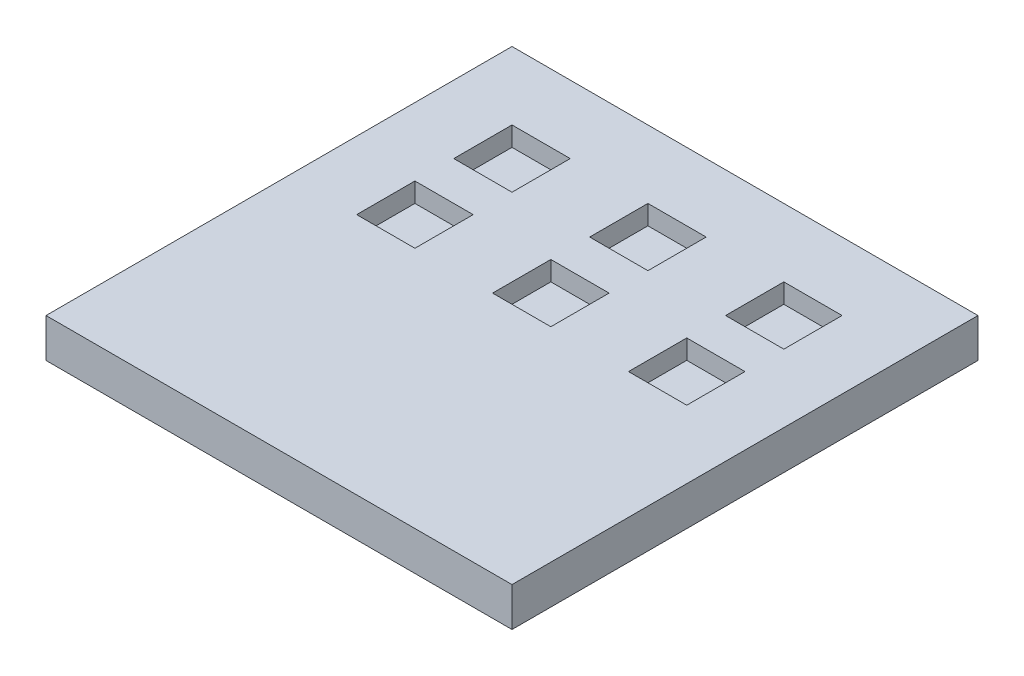
ISO-10303-21;
HEADER;
FILE_DESCRIPTION(('STEP AP214'),'2;1');
FILE_NAME('part.step','',(''),(''),'','','');
FILE_SCHEMA(('AUTOMOTIVE_DESIGN { 1 0 10303 214 1 1 1 1 }'));
ENDSEC;
DATA;
#1=APPLICATION_CONTEXT('core data for automotive mechanical design processes');
#2=APPLICATION_PROTOCOL_DEFINITION('international standard','automotive_design',2000,#1);
#3=PRODUCT_CONTEXT('',#1,'mechanical');
#4=PRODUCT('Part','Part','',(#3));
#5=PRODUCT_RELATED_PRODUCT_CATEGORY('part','',(#4));
#6=PRODUCT_DEFINITION_FORMATION('','',#4);
#7=PRODUCT_DEFINITION_CONTEXT('part definition',#1,'design');
#8=PRODUCT_DEFINITION('design','',#6,#7);
#9=PRODUCT_DEFINITION_SHAPE('','',#8);
#10=(LENGTH_UNIT() NAMED_UNIT(*) SI_UNIT(.MILLI.,.METRE.));
#11=(NAMED_UNIT(*) PLANE_ANGLE_UNIT() SI_UNIT($,.RADIAN.));
#12=(NAMED_UNIT(*) SI_UNIT($,.STERADIAN.) SOLID_ANGLE_UNIT());
#13=UNCERTAINTY_MEASURE_WITH_UNIT(LENGTH_MEASURE(1.E-05),#10,'distance_accuracy_value','');
#14=(GEOMETRIC_REPRESENTATION_CONTEXT(3) GLOBAL_UNCERTAINTY_ASSIGNED_CONTEXT((#13)) GLOBAL_UNIT_ASSIGNED_CONTEXT((#10,
#11,#12)) REPRESENTATION_CONTEXT('',''));
#15=CARTESIAN_POINT('',(0.,0.,0.));
#16=DIRECTION('',(0.,0.,1.));
#17=DIRECTION('',(1.,0.,0.));
#18=AXIS2_PLACEMENT_3D('',#15,#16,#17);
#19=CARTESIAN_POINT('',(177.8,12.7717860572301,63.5));
#20=DIRECTION('',(0.,-1.,0.));
#21=DIRECTION('',(0.,0.,-1.));
#22=AXIS2_PLACEMENT_3D('',#19,#20,#21);
#23=PLANE('',#22);
#24=DIRECTION('',(0.,0.,-1.));
#25=VECTOR('',#24,1.);
#26=CARTESIAN_POINT('',(107.95,12.7717860572301,-6.35000000000002));
#27=LINE('',#26,#25);
#28=CARTESIAN_POINT('',(107.95,12.7717860572301,-6.35000000000002));
#29=VERTEX_POINT('',#28);
#30=CARTESIAN_POINT('',(107.95,12.7717860572301,-44.45));
#31=VERTEX_POINT('',#30);
#32=EDGE_CURVE('E444',#29,#31,#27,.T.);
#33=ORIENTED_EDGE('',*,*,#32,.T.);
#34=DIRECTION('',(-1.,0.,0.));
#35=VECTOR('',#34,1.);
#36=CARTESIAN_POINT('',(69.85,12.7717860572301,-44.45));
#37=LINE('',#36,#35);
#38=CARTESIAN_POINT('',(69.85,12.7717860572301,-44.45));
#39=VERTEX_POINT('',#38);
#40=EDGE_CURVE('E11',#31,#39,#37,.T.);
#41=ORIENTED_EDGE('',*,*,#40,.T.);
#42=DIRECTION('',(0.,0.,1.));
#43=VECTOR('',#42,1.);
#44=CARTESIAN_POINT('',(69.85,12.7717860572301,-6.35000000000002));
#45=LINE('',#44,#43);
#46=CARTESIAN_POINT('',(69.85,12.7717860572301,-6.35000000000002));
#47=VERTEX_POINT('',#46);
#48=EDGE_CURVE('E51',#39,#47,#45,.T.);
#49=ORIENTED_EDGE('',*,*,#48,.T.);
#50=DIRECTION('',(1.,0.,0.));
#51=VECTOR('',#50,1.);
#52=CARTESIAN_POINT('',(69.85,12.7717860572301,-6.35000000000002));
#53=LINE('',#52,#51);
#54=EDGE_CURVE('E59',#47,#29,#53,.T.);
#55=ORIENTED_EDGE('',*,*,#54,.T.);
#56=EDGE_LOOP('',(#33,#41,#49,#55));
#57=FACE_BOUND('',#56,.T.);
#58=ADVANCED_FACE('F37',(#57),#23,.F.);
#59=CARTESIAN_POINT('',(69.85,12.7717860572301,-44.45));
#60=DIRECTION('',(0.,0.,-1.));
#61=DIRECTION('',(-1.,0.,0.));
#62=AXIS2_PLACEMENT_3D('',#59,#60,#61);
#63=PLANE('',#62);
#64=DIRECTION('',(-1.,0.,0.));
#65=VECTOR('',#64,1.);
#66=CARTESIAN_POINT('',(69.85,25.4717860572301,-44.45));
#67=LINE('',#66,#65);
#68=CARTESIAN_POINT('',(107.95,25.4717860572301,-44.45));
#69=VERTEX_POINT('',#68);
#70=CARTESIAN_POINT('',(69.85,25.4717860572301,-44.45));
#71=VERTEX_POINT('',#70);
#72=EDGE_CURVE('E438',#69,#71,#67,.T.);
#73=ORIENTED_EDGE('',*,*,#72,.T.);
#74=DIRECTION('',(0.,1.,0.));
#75=VECTOR('',#74,1.);
#76=CARTESIAN_POINT('',(69.85,12.7717860572301,-44.45));
#77=LINE('',#76,#75);
#78=EDGE_CURVE('E44',#39,#71,#77,.T.);
#79=ORIENTED_EDGE('',*,*,#78,.F.);
#80=ORIENTED_EDGE('',*,*,#40,.F.);
#81=DIRECTION('',(0.,1.,0.));
#82=VECTOR('',#81,1.);
#83=CARTESIAN_POINT('',(107.95,12.7717860572301,-44.45));
#84=LINE('',#83,#82);
#85=EDGE_CURVE('E441',#31,#69,#84,.T.);
#86=ORIENTED_EDGE('',*,*,#85,.T.);
#87=EDGE_LOOP('',(#73,#79,#80,#86));
#88=FACE_BOUND('',#87,.T.);
#89=ADVANCED_FACE('F456',(#88),#63,.F.);
#90=CARTESIAN_POINT('',(69.85,12.7717860572301,-6.35000000000002));
#91=DIRECTION('',(-1.,0.,0.));
#92=DIRECTION('',(0.,0.,1.));
#93=AXIS2_PLACEMENT_3D('',#90,#91,#92);
#94=PLANE('',#93);
#95=DIRECTION('',(0.,0.,1.));
#96=VECTOR('',#95,1.);
#97=CARTESIAN_POINT('',(69.85,25.4717860572301,-6.35000000000002));
#98=LINE('',#97,#96);
#99=CARTESIAN_POINT('',(69.85,25.4717860572301,-6.35000000000002));
#100=VERTEX_POINT('',#99);
#101=EDGE_CURVE('E435',#71,#100,#98,.T.);
#102=ORIENTED_EDGE('',*,*,#101,.T.);
#103=DIRECTION('',(0.,1.,0.));
#104=VECTOR('',#103,1.);
#105=CARTESIAN_POINT('',(69.85,12.7717860572301,-6.35000000000002));
#106=LINE('',#105,#104);
#107=EDGE_CURVE('E451',#47,#100,#106,.T.);
#108=ORIENTED_EDGE('',*,*,#107,.F.);
#109=ORIENTED_EDGE('',*,*,#48,.F.);
#110=ORIENTED_EDGE('',*,*,#78,.T.);
#111=EDGE_LOOP('',(#102,#108,#109,#110));
#112=FACE_BOUND('',#111,.T.);
#113=ADVANCED_FACE('F453',(#112),#94,.F.);
#114=CARTESIAN_POINT('',(69.85,12.7717860572301,-6.35000000000002));
#115=DIRECTION('',(0.,0.,1.));
#116=DIRECTION('',(1.,0.,0.));
#117=AXIS2_PLACEMENT_3D('',#114,#115,#116);
#118=PLANE('',#117);
#119=DIRECTION('',(1.,0.,0.));
#120=VECTOR('',#119,1.);
#121=CARTESIAN_POINT('',(69.85,25.4717860572301,-6.35000000000002));
#122=LINE('',#121,#120);
#123=CARTESIAN_POINT('',(107.95,25.4717860572301,-6.35000000000002));
#124=VERTEX_POINT('',#123);
#125=EDGE_CURVE('E432',#100,#124,#122,.T.);
#126=ORIENTED_EDGE('',*,*,#125,.T.);
#127=DIRECTION('',(0.,1.,0.));
#128=VECTOR('',#127,1.);
#129=CARTESIAN_POINT('',(107.95,12.7717860572301,-6.35000000000002));
#130=LINE('',#129,#128);
#131=EDGE_CURVE('E447',#29,#124,#130,.T.);
#132=ORIENTED_EDGE('',*,*,#131,.F.);
#133=ORIENTED_EDGE('',*,*,#54,.F.);
#134=ORIENTED_EDGE('',*,*,#107,.T.);
#135=EDGE_LOOP('',(#126,#132,#133,#134));
#136=FACE_BOUND('',#135,.T.);
#137=ADVANCED_FACE('F461',(#136),#118,.F.);
#138=CARTESIAN_POINT('',(107.95,12.7717860572301,-6.35000000000002));
#139=DIRECTION('',(1.,0.,0.));
#140=DIRECTION('',(0.,0.,-1.));
#141=AXIS2_PLACEMENT_3D('',#138,#139,#140);
#142=PLANE('',#141);
#143=DIRECTION('',(0.,0.,-1.));
#144=VECTOR('',#143,1.);
#145=CARTESIAN_POINT('',(107.95,25.4717860572301,-6.35000000000002));
#146=LINE('',#145,#144);
#147=EDGE_CURVE('E430',#124,#69,#146,.T.);
#148=ORIENTED_EDGE('',*,*,#147,.T.);
#149=ORIENTED_EDGE('',*,*,#85,.F.);
#150=ORIENTED_EDGE('',*,*,#32,.F.);
#151=ORIENTED_EDGE('',*,*,#131,.T.);
#152=EDGE_LOOP('',(#148,#149,#150,#151));
#153=FACE_BOUND('',#152,.T.);
#154=ADVANCED_FACE('F460',(#153),#142,.F.);
#155=CARTESIAN_POINT('',(177.8,12.7717860572301,0.));
#156=DIRECTION('',(0.,-1.,0.));
#157=DIRECTION('',(0.,0.,-1.));
#158=AXIS2_PLACEMENT_3D('',#155,#156,#157);
#159=PLANE('',#158);
#160=DIRECTION('',(0.,0.,-1.));
#161=VECTOR('',#160,1.);
#162=CARTESIAN_POINT('',(107.95,12.7717860572301,-69.85));
#163=LINE('',#162,#161);
#164=CARTESIAN_POINT('',(107.95,12.7717860572301,-69.85));
#165=VERTEX_POINT('',#164);
#166=CARTESIAN_POINT('',(107.95,12.7717860572301,-107.95));
#167=VERTEX_POINT('',#166);
#168=EDGE_CURVE('E409',#165,#167,#163,.T.);
#169=ORIENTED_EDGE('',*,*,#168,.T.);
#170=DIRECTION('',(-1.,0.,0.));
#171=VECTOR('',#170,1.);
#172=CARTESIAN_POINT('',(69.85,12.7717860572301,-107.95));
#173=LINE('',#172,#171);
#174=CARTESIAN_POINT('',(69.85,12.7717860572301,-107.95));
#175=VERTEX_POINT('',#174);
#176=EDGE_CURVE('E427',#167,#175,#173,.T.);
#177=ORIENTED_EDGE('',*,*,#176,.T.);
#178=DIRECTION('',(0.,0.,1.));
#179=VECTOR('',#178,1.);
#180=CARTESIAN_POINT('',(69.85,12.7717860572301,-69.85));
#181=LINE('',#180,#179);
#182=CARTESIAN_POINT('',(69.85,12.7717860572301,-69.85));
#183=VERTEX_POINT('',#182);
#184=EDGE_CURVE('E421',#175,#183,#181,.T.);
#185=ORIENTED_EDGE('',*,*,#184,.T.);
#186=DIRECTION('',(1.,0.,0.));
#187=VECTOR('',#186,1.);
#188=CARTESIAN_POINT('',(69.85,12.7717860572301,-69.85));
#189=LINE('',#188,#187);
#190=EDGE_CURVE('E415',#183,#165,#189,.T.);
#191=ORIENTED_EDGE('',*,*,#190,.T.);
#192=EDGE_LOOP('',(#169,#177,#185,#191));
#193=FACE_BOUND('',#192,.T.);
#194=ADVANCED_FACE('F494',(#193),#159,.F.);
#195=CARTESIAN_POINT('',(69.85,12.7717860572301,-107.95));
#196=DIRECTION('',(0.,0.,-1.));
#197=DIRECTION('',(-1.,0.,0.));
#198=AXIS2_PLACEMENT_3D('',#195,#196,#197);
#199=PLANE('',#198);
#200=DIRECTION('',(-1.,0.,0.));
#201=VECTOR('',#200,1.);
#202=CARTESIAN_POINT('',(69.85,25.4717860572301,-107.95));
#203=LINE('',#202,#201);
#204=CARTESIAN_POINT('',(107.95,25.4717860572301,-107.95));
#205=VERTEX_POINT('',#204);
#206=CARTESIAN_POINT('',(69.85,25.4717860572301,-107.95));
#207=VERTEX_POINT('',#206);
#208=EDGE_CURVE('E403',#205,#207,#203,.T.);
#209=ORIENTED_EDGE('',*,*,#208,.T.);
#210=DIRECTION('',(0.,1.,0.));
#211=VECTOR('',#210,1.);
#212=CARTESIAN_POINT('',(69.85,12.7717860572301,-107.95));
#213=LINE('',#212,#211);
#214=EDGE_CURVE('E424',#175,#207,#213,.T.);
#215=ORIENTED_EDGE('',*,*,#214,.F.);
#216=ORIENTED_EDGE('',*,*,#176,.F.);
#217=DIRECTION('',(0.,1.,0.));
#218=VECTOR('',#217,1.);
#219=CARTESIAN_POINT('',(107.95,12.7717860572301,-107.95));
#220=LINE('',#219,#218);
#221=EDGE_CURVE('E406',#167,#205,#220,.T.);
#222=ORIENTED_EDGE('',*,*,#221,.T.);
#223=EDGE_LOOP('',(#209,#215,#216,#222));
#224=FACE_BOUND('',#223,.T.);
#225=ADVANCED_FACE('F497',(#224),#199,.F.);
#226=CARTESIAN_POINT('',(69.85,12.7717860572301,-69.85));
#227=DIRECTION('',(-1.,0.,0.));
#228=DIRECTION('',(0.,0.,1.));
#229=AXIS2_PLACEMENT_3D('',#226,#227,#228);
#230=PLANE('',#229);
#231=DIRECTION('',(0.,0.,1.));
#232=VECTOR('',#231,1.);
#233=CARTESIAN_POINT('',(69.85,25.4717860572301,-69.85));
#234=LINE('',#233,#232);
#235=CARTESIAN_POINT('',(69.85,25.4717860572301,-69.85));
#236=VERTEX_POINT('',#235);
#237=EDGE_CURVE('E400',#207,#236,#234,.T.);
#238=ORIENTED_EDGE('',*,*,#237,.T.);
#239=DIRECTION('',(0.,1.,0.));
#240=VECTOR('',#239,1.);
#241=CARTESIAN_POINT('',(69.85,12.7717860572301,-69.85));
#242=LINE('',#241,#240);
#243=EDGE_CURVE('E418',#183,#236,#242,.T.);
#244=ORIENTED_EDGE('',*,*,#243,.F.);
#245=ORIENTED_EDGE('',*,*,#184,.F.);
#246=ORIENTED_EDGE('',*,*,#214,.T.);
#247=EDGE_LOOP('',(#238,#244,#245,#246));
#248=FACE_BOUND('',#247,.T.);
#249=ADVANCED_FACE('F501',(#248),#230,.F.);
#250=CARTESIAN_POINT('',(69.85,12.7717860572301,-69.85));
#251=DIRECTION('',(0.,0.,1.));
#252=DIRECTION('',(1.,0.,0.));
#253=AXIS2_PLACEMENT_3D('',#250,#251,#252);
#254=PLANE('',#253);
#255=DIRECTION('',(1.,0.,0.));
#256=VECTOR('',#255,1.);
#257=CARTESIAN_POINT('',(69.85,25.4717860572301,-69.85));
#258=LINE('',#257,#256);
#259=CARTESIAN_POINT('',(107.95,25.4717860572301,-69.85));
#260=VERTEX_POINT('',#259);
#261=EDGE_CURVE('E397',#236,#260,#258,.T.);
#262=ORIENTED_EDGE('',*,*,#261,.T.);
#263=DIRECTION('',(0.,1.,0.));
#264=VECTOR('',#263,1.);
#265=CARTESIAN_POINT('',(107.95,12.7717860572301,-69.85));
#266=LINE('',#265,#264);
#267=EDGE_CURVE('E412',#165,#260,#266,.T.);
#268=ORIENTED_EDGE('',*,*,#267,.F.);
#269=ORIENTED_EDGE('',*,*,#190,.F.);
#270=ORIENTED_EDGE('',*,*,#243,.T.);
#271=EDGE_LOOP('',(#262,#268,#269,#270));
#272=FACE_BOUND('',#271,.T.);
#273=ADVANCED_FACE('F505',(#272),#254,.F.);
#274=CARTESIAN_POINT('',(107.95,12.7717860572301,-69.85));
#275=DIRECTION('',(1.,0.,0.));
#276=DIRECTION('',(0.,0.,-1.));
#277=AXIS2_PLACEMENT_3D('',#274,#275,#276);
#278=PLANE('',#277);
#279=DIRECTION('',(0.,0.,-1.));
#280=VECTOR('',#279,1.);
#281=CARTESIAN_POINT('',(107.95,25.4717860572301,-69.85));
#282=LINE('',#281,#280);
#283=EDGE_CURVE('E395',#260,#205,#282,.T.);
#284=ORIENTED_EDGE('',*,*,#283,.T.);
#285=ORIENTED_EDGE('',*,*,#221,.F.);
#286=ORIENTED_EDGE('',*,*,#168,.F.);
#287=ORIENTED_EDGE('',*,*,#267,.T.);
#288=EDGE_LOOP('',(#284,#285,#286,#287));
#289=FACE_BOUND('',#288,.T.);
#290=ADVANCED_FACE('F509',(#289),#278,.F.);
#291=CARTESIAN_POINT('',(88.9,12.7717860572301,63.5));
#292=DIRECTION('',(0.,-1.,0.));
#293=DIRECTION('',(0.,0.,-1.));
#294=AXIS2_PLACEMENT_3D('',#291,#292,#293);
#295=PLANE('',#294);
#296=DIRECTION('',(0.,0.,-1.));
#297=VECTOR('',#296,1.);
#298=CARTESIAN_POINT('',(19.05,12.7717860572301,-6.35000000000002));
#299=LINE('',#298,#297);
#300=CARTESIAN_POINT('',(19.05,12.7717860572301,-6.35000000000002));
#301=VERTEX_POINT('',#300);
#302=CARTESIAN_POINT('',(19.05,12.7717860572301,-44.45));
#303=VERTEX_POINT('',#302);
#304=EDGE_CURVE('E374',#301,#303,#299,.T.);
#305=ORIENTED_EDGE('',*,*,#304,.T.);
#306=DIRECTION('',(-1.,0.,0.));
#307=VECTOR('',#306,1.);
#308=CARTESIAN_POINT('',(-19.05,12.7717860572301,-44.45));
#309=LINE('',#308,#307);
#310=CARTESIAN_POINT('',(-19.05,12.7717860572301,-44.45));
#311=VERTEX_POINT('',#310);
#312=EDGE_CURVE('E392',#303,#311,#309,.T.);
#313=ORIENTED_EDGE('',*,*,#312,.T.);
#314=DIRECTION('',(0.,0.,1.));
#315=VECTOR('',#314,1.);
#316=CARTESIAN_POINT('',(-19.05,12.7717860572301,-6.35000000000002));
#317=LINE('',#316,#315);
#318=CARTESIAN_POINT('',(-19.05,12.7717860572301,-6.35000000000002));
#319=VERTEX_POINT('',#318);
#320=EDGE_CURVE('E386',#311,#319,#317,.T.);
#321=ORIENTED_EDGE('',*,*,#320,.T.);
#322=DIRECTION('',(1.,0.,0.));
#323=VECTOR('',#322,1.);
#324=CARTESIAN_POINT('',(-19.05,12.7717860572301,-6.35000000000002));
#325=LINE('',#324,#323);
#326=EDGE_CURVE('E380',#319,#301,#325,.T.);
#327=ORIENTED_EDGE('',*,*,#326,.T.);
#328=EDGE_LOOP('',(#305,#313,#321,#327));
#329=FACE_BOUND('',#328,.T.);
#330=ADVANCED_FACE('F513',(#329),#295,.F.);
#331=CARTESIAN_POINT('',(-19.05,12.7717860572301,-44.45));
#332=DIRECTION('',(0.,0.,-1.));
#333=DIRECTION('',(-1.,0.,0.));
#334=AXIS2_PLACEMENT_3D('',#331,#332,#333);
#335=PLANE('',#334);
#336=DIRECTION('',(-1.,0.,0.));
#337=VECTOR('',#336,1.);
#338=CARTESIAN_POINT('',(-19.05,25.4717860572301,-44.45));
#339=LINE('',#338,#337);
#340=CARTESIAN_POINT('',(19.05,25.4717860572301,-44.45));
#341=VERTEX_POINT('',#340);
#342=CARTESIAN_POINT('',(-19.05,25.4717860572301,-44.45));
#343=VERTEX_POINT('',#342);
#344=EDGE_CURVE('E368',#341,#343,#339,.T.);
#345=ORIENTED_EDGE('',*,*,#344,.T.);
#346=DIRECTION('',(0.,1.,0.));
#347=VECTOR('',#346,1.);
#348=CARTESIAN_POINT('',(-19.05,12.7717860572301,-44.45));
#349=LINE('',#348,#347);
#350=EDGE_CURVE('E389',#311,#343,#349,.T.);
#351=ORIENTED_EDGE('',*,*,#350,.F.);
#352=ORIENTED_EDGE('',*,*,#312,.F.);
#353=DIRECTION('',(0.,1.,0.));
#354=VECTOR('',#353,1.);
#355=CARTESIAN_POINT('',(19.05,12.7717860572301,-44.45));
#356=LINE('',#355,#354);
#357=EDGE_CURVE('E371',#303,#341,#356,.T.);
#358=ORIENTED_EDGE('',*,*,#357,.T.);
#359=EDGE_LOOP('',(#345,#351,#352,#358));
#360=FACE_BOUND('',#359,.T.);
#361=ADVANCED_FACE('F517',(#360),#335,.F.);
#362=CARTESIAN_POINT('',(-19.05,12.7717860572301,-6.35000000000002));
#363=DIRECTION('',(-1.,0.,0.));
#364=DIRECTION('',(0.,0.,1.));
#365=AXIS2_PLACEMENT_3D('',#362,#363,#364);
#366=PLANE('',#365);
#367=DIRECTION('',(0.,0.,1.));
#368=VECTOR('',#367,1.);
#369=CARTESIAN_POINT('',(-19.05,25.4717860572301,-6.35000000000002));
#370=LINE('',#369,#368);
#371=CARTESIAN_POINT('',(-19.05,25.4717860572301,-6.35000000000002));
#372=VERTEX_POINT('',#371);
#373=EDGE_CURVE('E365',#343,#372,#370,.T.);
#374=ORIENTED_EDGE('',*,*,#373,.T.);
#375=DIRECTION('',(0.,1.,0.));
#376=VECTOR('',#375,1.);
#377=CARTESIAN_POINT('',(-19.05,12.7717860572301,-6.35000000000002));
#378=LINE('',#377,#376);
#379=EDGE_CURVE('E383',#319,#372,#378,.T.);
#380=ORIENTED_EDGE('',*,*,#379,.F.);
#381=ORIENTED_EDGE('',*,*,#320,.F.);
#382=ORIENTED_EDGE('',*,*,#350,.T.);
#383=EDGE_LOOP('',(#374,#380,#381,#382));
#384=FACE_BOUND('',#383,.T.);
#385=ADVANCED_FACE('F521',(#384),#366,.F.);
#386=CARTESIAN_POINT('',(-19.05,12.7717860572301,-6.35000000000002));
#387=DIRECTION('',(0.,0.,1.));
#388=DIRECTION('',(1.,0.,0.));
#389=AXIS2_PLACEMENT_3D('',#386,#387,#388);
#390=PLANE('',#389);
#391=DIRECTION('',(1.,0.,0.));
#392=VECTOR('',#391,1.);
#393=CARTESIAN_POINT('',(-19.05,25.4717860572301,-6.35000000000002));
#394=LINE('',#393,#392);
#395=CARTESIAN_POINT('',(19.05,25.4717860572301,-6.35000000000002));
#396=VERTEX_POINT('',#395);
#397=EDGE_CURVE('E362',#372,#396,#394,.T.);
#398=ORIENTED_EDGE('',*,*,#397,.T.);
#399=DIRECTION('',(0.,1.,0.));
#400=VECTOR('',#399,1.);
#401=CARTESIAN_POINT('',(19.05,12.7717860572301,-6.35000000000002));
#402=LINE('',#401,#400);
#403=EDGE_CURVE('E377',#301,#396,#402,.T.);
#404=ORIENTED_EDGE('',*,*,#403,.F.);
#405=ORIENTED_EDGE('',*,*,#326,.F.);
#406=ORIENTED_EDGE('',*,*,#379,.T.);
#407=EDGE_LOOP('',(#398,#404,#405,#406));
#408=FACE_BOUND('',#407,.T.);
#409=ADVANCED_FACE('F525',(#408),#390,.F.);
#410=CARTESIAN_POINT('',(19.05,12.7717860572301,-6.35000000000002));
#411=DIRECTION('',(1.,0.,0.));
#412=DIRECTION('',(0.,0.,-1.));
#413=AXIS2_PLACEMENT_3D('',#410,#411,#412);
#414=PLANE('',#413);
#415=DIRECTION('',(0.,0.,-1.));
#416=VECTOR('',#415,1.);
#417=CARTESIAN_POINT('',(19.05,25.4717860572301,-6.35000000000002));
#418=LINE('',#417,#416);
#419=EDGE_CURVE('E360',#396,#341,#418,.T.);
#420=ORIENTED_EDGE('',*,*,#419,.T.);
#421=ORIENTED_EDGE('',*,*,#357,.F.);
#422=ORIENTED_EDGE('',*,*,#304,.F.);
#423=ORIENTED_EDGE('',*,*,#403,.T.);
#424=EDGE_LOOP('',(#420,#421,#422,#423));
#425=FACE_BOUND('',#424,.T.);
#426=ADVANCED_FACE('F529',(#425),#414,.F.);
#427=CARTESIAN_POINT('',(88.9,12.7717860572301,0.));
#428=DIRECTION('',(0.,-1.,0.));
#429=DIRECTION('',(0.,0.,-1.));
#430=AXIS2_PLACEMENT_3D('',#427,#428,#429);
#431=PLANE('',#430);
#432=DIRECTION('',(0.,0.,-1.));
#433=VECTOR('',#432,1.);
#434=CARTESIAN_POINT('',(19.05,12.7717860572301,-69.85));
#435=LINE('',#434,#433);
#436=CARTESIAN_POINT('',(19.05,12.7717860572301,-69.85));
#437=VERTEX_POINT('',#436);
#438=CARTESIAN_POINT('',(19.05,12.7717860572301,-107.95));
#439=VERTEX_POINT('',#438);
#440=EDGE_CURVE('E339',#437,#439,#435,.T.);
#441=ORIENTED_EDGE('',*,*,#440,.T.);
#442=DIRECTION('',(-1.,0.,0.));
#443=VECTOR('',#442,1.);
#444=CARTESIAN_POINT('',(-19.05,12.7717860572301,-107.95));
#445=LINE('',#444,#443);
#446=CARTESIAN_POINT('',(-19.05,12.7717860572301,-107.95));
#447=VERTEX_POINT('',#446);
#448=EDGE_CURVE('E357',#439,#447,#445,.T.);
#449=ORIENTED_EDGE('',*,*,#448,.T.);
#450=DIRECTION('',(0.,0.,1.));
#451=VECTOR('',#450,1.);
#452=CARTESIAN_POINT('',(-19.05,12.7717860572301,-69.85));
#453=LINE('',#452,#451);
#454=CARTESIAN_POINT('',(-19.05,12.7717860572301,-69.85));
#455=VERTEX_POINT('',#454);
#456=EDGE_CURVE('E351',#447,#455,#453,.T.);
#457=ORIENTED_EDGE('',*,*,#456,.T.);
#458=DIRECTION('',(1.,0.,0.));
#459=VECTOR('',#458,1.);
#460=CARTESIAN_POINT('',(-19.05,12.7717860572301,-69.85));
#461=LINE('',#460,#459);
#462=EDGE_CURVE('E345',#455,#437,#461,.T.);
#463=ORIENTED_EDGE('',*,*,#462,.T.);
#464=EDGE_LOOP('',(#441,#449,#457,#463));
#465=FACE_BOUND('',#464,.T.);
#466=ADVANCED_FACE('F533',(#465),#431,.F.);
#467=CARTESIAN_POINT('',(-19.05,12.7717860572301,-107.95));
#468=DIRECTION('',(0.,0.,-1.));
#469=DIRECTION('',(-1.,0.,0.));
#470=AXIS2_PLACEMENT_3D('',#467,#468,#469);
#471=PLANE('',#470);
#472=DIRECTION('',(-1.,0.,0.));
#473=VECTOR('',#472,1.);
#474=CARTESIAN_POINT('',(-19.05,25.4717860572301,-107.95));
#475=LINE('',#474,#473);
#476=CARTESIAN_POINT('',(19.05,25.4717860572301,-107.95));
#477=VERTEX_POINT('',#476);
#478=CARTESIAN_POINT('',(-19.05,25.4717860572301,-107.95));
#479=VERTEX_POINT('',#478);
#480=EDGE_CURVE('E333',#477,#479,#475,.T.);
#481=ORIENTED_EDGE('',*,*,#480,.T.);
#482=DIRECTION('',(0.,1.,0.));
#483=VECTOR('',#482,1.);
#484=CARTESIAN_POINT('',(-19.05,12.7717860572301,-107.95));
#485=LINE('',#484,#483);
#486=EDGE_CURVE('E354',#447,#479,#485,.T.);
#487=ORIENTED_EDGE('',*,*,#486,.F.);
#488=ORIENTED_EDGE('',*,*,#448,.F.);
#489=DIRECTION('',(0.,1.,0.));
#490=VECTOR('',#489,1.);
#491=CARTESIAN_POINT('',(19.05,12.7717860572301,-107.95));
#492=LINE('',#491,#490);
#493=EDGE_CURVE('E336',#439,#477,#492,.T.);
#494=ORIENTED_EDGE('',*,*,#493,.T.);
#495=EDGE_LOOP('',(#481,#487,#488,#494));
#496=FACE_BOUND('',#495,.T.);
#497=ADVANCED_FACE('F537',(#496),#471,.F.);
#498=CARTESIAN_POINT('',(-19.05,12.7717860572301,-69.85));
#499=DIRECTION('',(-1.,0.,0.));
#500=DIRECTION('',(0.,0.,1.));
#501=AXIS2_PLACEMENT_3D('',#498,#499,#500);
#502=PLANE('',#501);
#503=DIRECTION('',(0.,0.,1.));
#504=VECTOR('',#503,1.);
#505=CARTESIAN_POINT('',(-19.05,25.4717860572301,-69.85));
#506=LINE('',#505,#504);
#507=CARTESIAN_POINT('',(-19.05,25.4717860572301,-69.85));
#508=VERTEX_POINT('',#507);
#509=EDGE_CURVE('E330',#479,#508,#506,.T.);
#510=ORIENTED_EDGE('',*,*,#509,.T.);
#511=DIRECTION('',(0.,1.,0.));
#512=VECTOR('',#511,1.);
#513=CARTESIAN_POINT('',(-19.05,12.7717860572301,-69.85));
#514=LINE('',#513,#512);
#515=EDGE_CURVE('E348',#455,#508,#514,.T.);
#516=ORIENTED_EDGE('',*,*,#515,.F.);
#517=ORIENTED_EDGE('',*,*,#456,.F.);
#518=ORIENTED_EDGE('',*,*,#486,.T.);
#519=EDGE_LOOP('',(#510,#516,#517,#518));
#520=FACE_BOUND('',#519,.T.);
#521=ADVANCED_FACE('F541',(#520),#502,.F.);
#522=CARTESIAN_POINT('',(-19.05,12.7717860572301,-69.85));
#523=DIRECTION('',(0.,0.,1.));
#524=DIRECTION('',(1.,0.,0.));
#525=AXIS2_PLACEMENT_3D('',#522,#523,#524);
#526=PLANE('',#525);
#527=DIRECTION('',(1.,0.,0.));
#528=VECTOR('',#527,1.);
#529=CARTESIAN_POINT('',(-19.05,25.4717860572301,-69.85));
#530=LINE('',#529,#528);
#531=CARTESIAN_POINT('',(19.05,25.4717860572301,-69.85));
#532=VERTEX_POINT('',#531);
#533=EDGE_CURVE('E327',#508,#532,#530,.T.);
#534=ORIENTED_EDGE('',*,*,#533,.T.);
#535=DIRECTION('',(0.,1.,0.));
#536=VECTOR('',#535,1.);
#537=CARTESIAN_POINT('',(19.05,12.7717860572301,-69.85));
#538=LINE('',#537,#536);
#539=EDGE_CURVE('E342',#437,#532,#538,.T.);
#540=ORIENTED_EDGE('',*,*,#539,.F.);
#541=ORIENTED_EDGE('',*,*,#462,.F.);
#542=ORIENTED_EDGE('',*,*,#515,.T.);
#543=EDGE_LOOP('',(#534,#540,#541,#542));
#544=FACE_BOUND('',#543,.T.);
#545=ADVANCED_FACE('F545',(#544),#526,.F.);
#546=CARTESIAN_POINT('',(19.05,12.7717860572301,-69.85));
#547=DIRECTION('',(1.,0.,0.));
#548=DIRECTION('',(0.,0.,-1.));
#549=AXIS2_PLACEMENT_3D('',#546,#547,#548);
#550=PLANE('',#549);
#551=DIRECTION('',(0.,0.,-1.));
#552=VECTOR('',#551,1.);
#553=CARTESIAN_POINT('',(19.05,25.4717860572301,-69.85));
#554=LINE('',#553,#552);
#555=EDGE_CURVE('E325',#532,#477,#554,.T.);
#556=ORIENTED_EDGE('',*,*,#555,.T.);
#557=ORIENTED_EDGE('',*,*,#493,.F.);
#558=ORIENTED_EDGE('',*,*,#440,.F.);
#559=ORIENTED_EDGE('',*,*,#539,.T.);
#560=EDGE_LOOP('',(#556,#557,#558,#559));
#561=FACE_BOUND('',#560,.T.);
#562=ADVANCED_FACE('F549',(#561),#550,.F.);
#563=CARTESIAN_POINT('',(152.4,25.4717860572301,152.4));
#564=DIRECTION('',(-1.,0.,0.));
#565=DIRECTION('',(0.,0.,1.));
#566=AXIS2_PLACEMENT_3D('',#563,#564,#565);
#567=PLANE('',#566);
#568=DIRECTION('',(0.,0.,-1.));
#569=VECTOR('',#568,1.);
#570=CARTESIAN_POINT('',(152.4,0.,152.4));
#571=LINE('',#570,#569);
#572=CARTESIAN_POINT('',(152.4,0.,152.4));
#573=VERTEX_POINT('',#572);
#574=CARTESIAN_POINT('',(152.4,0.,-152.4));
#575=VERTEX_POINT('',#574);
#576=EDGE_CURVE('E289',#573,#575,#571,.T.);
#577=ORIENTED_EDGE('',*,*,#576,.T.);
#578=DIRECTION('',(0.,-1.,0.));
#579=VECTOR('',#578,1.);
#580=CARTESIAN_POINT('',(152.4,25.4717860572301,-152.4));
#581=LINE('',#580,#579);
#582=CARTESIAN_POINT('',(152.4,25.4717860572301,-152.4));
#583=VERTEX_POINT('',#582);
#584=EDGE_CURVE('E322',#583,#575,#581,.T.);
#585=ORIENTED_EDGE('',*,*,#584,.F.);
#586=DIRECTION('',(0.,0.,-1.));
#587=VECTOR('',#586,1.);
#588=CARTESIAN_POINT('',(152.4,25.4717860572301,152.4));
#589=LINE('',#588,#587);
#590=CARTESIAN_POINT('',(152.4,25.4717860572301,152.4));
#591=VERTEX_POINT('',#590);
#592=EDGE_CURVE('E296',#591,#583,#589,.T.);
#593=ORIENTED_EDGE('',*,*,#592,.F.);
#594=DIRECTION('',(0.,-1.,0.));
#595=VECTOR('',#594,1.);
#596=CARTESIAN_POINT('',(152.4,25.4717860572301,152.4));
#597=LINE('',#596,#595);
#598=EDGE_CURVE('E306',#591,#573,#597,.T.);
#599=ORIENTED_EDGE('',*,*,#598,.T.);
#600=EDGE_LOOP('',(#577,#585,#593,#599));
#601=FACE_BOUND('',#600,.T.);
#602=ADVANCED_FACE('F553',(#601),#567,.F.);
#603=CARTESIAN_POINT('',(-152.4,25.4717860572301,-152.4));
#604=DIRECTION('',(0.,0.,1.));
#605=DIRECTION('',(1.,0.,0.));
#606=AXIS2_PLACEMENT_3D('',#603,#604,#605);
#607=PLANE('',#606);
#608=DIRECTION('',(-1.,0.,0.));
#609=VECTOR('',#608,1.);
#610=CARTESIAN_POINT('',(-152.4,0.,-152.4));
#611=LINE('',#610,#609);
#612=CARTESIAN_POINT('',(-152.4,0.,-152.4));
#613=VERTEX_POINT('',#612);
#614=EDGE_CURVE('E309',#575,#613,#611,.T.);
#615=ORIENTED_EDGE('',*,*,#614,.T.);
#616=DIRECTION('',(0.,-1.,0.));
#617=VECTOR('',#616,1.);
#618=CARTESIAN_POINT('',(-152.4,25.4717860572301,-152.4));
#619=LINE('',#618,#617);
#620=CARTESIAN_POINT('',(-152.4,25.4717860572301,-152.4));
#621=VERTEX_POINT('',#620);
#622=EDGE_CURVE('E319',#621,#613,#619,.T.);
#623=ORIENTED_EDGE('',*,*,#622,.F.);
#624=DIRECTION('',(-1.,0.,0.));
#625=VECTOR('',#624,1.);
#626=CARTESIAN_POINT('',(-152.4,25.4717860572301,-152.4));
#627=LINE('',#626,#625);
#628=EDGE_CURVE('E299',#583,#621,#627,.T.);
#629=ORIENTED_EDGE('',*,*,#628,.F.);
#630=ORIENTED_EDGE('',*,*,#584,.T.);
#631=EDGE_LOOP('',(#615,#623,#629,#630));
#632=FACE_BOUND('',#631,.T.);
#633=ADVANCED_FACE('F557',(#632),#607,.F.);
#634=CARTESIAN_POINT('',(-152.4,25.4717860572301,152.4));
#635=DIRECTION('',(1.,0.,0.));
#636=DIRECTION('',(0.,0.,-1.));
#637=AXIS2_PLACEMENT_3D('',#634,#635,#636);
#638=PLANE('',#637);
#639=DIRECTION('',(0.,0.,1.));
#640=VECTOR('',#639,1.);
#641=CARTESIAN_POINT('',(-152.4,0.,152.4));
#642=LINE('',#641,#640);
#643=CARTESIAN_POINT('',(-152.4,0.,152.4));
#644=VERTEX_POINT('',#643);
#645=EDGE_CURVE('E311',#613,#644,#642,.T.);
#646=ORIENTED_EDGE('',*,*,#645,.T.);
#647=DIRECTION('',(0.,-1.,0.));
#648=VECTOR('',#647,1.);
#649=CARTESIAN_POINT('',(-152.4,25.4717860572301,152.4));
#650=LINE('',#649,#648);
#651=CARTESIAN_POINT('',(-152.4,25.4717860572301,152.4));
#652=VERTEX_POINT('',#651);
#653=EDGE_CURVE('E316',#652,#644,#650,.T.);
#654=ORIENTED_EDGE('',*,*,#653,.F.);
#655=DIRECTION('',(0.,0.,1.));
#656=VECTOR('',#655,1.);
#657=CARTESIAN_POINT('',(-152.4,25.4717860572301,152.4));
#658=LINE('',#657,#656);
#659=EDGE_CURVE('E302',#621,#652,#658,.T.);
#660=ORIENTED_EDGE('',*,*,#659,.F.);
#661=ORIENTED_EDGE('',*,*,#622,.T.);
#662=EDGE_LOOP('',(#646,#654,#660,#661));
#663=FACE_BOUND('',#662,.T.);
#664=ADVANCED_FACE('F476',(#663),#638,.F.);
#665=CARTESIAN_POINT('',(-152.4,25.4717860572301,152.4));
#666=DIRECTION('',(0.,0.,-1.));
#667=DIRECTION('',(-1.,0.,0.));
#668=AXIS2_PLACEMENT_3D('',#665,#666,#667);
#669=PLANE('',#668);
#670=DIRECTION('',(1.,0.,0.));
#671=VECTOR('',#670,1.);
#672=CARTESIAN_POINT('',(-152.4,0.,152.4));
#673=LINE('',#672,#671);
#674=EDGE_CURVE('E300',#644,#573,#673,.T.);
#675=ORIENTED_EDGE('',*,*,#674,.T.);
#676=ORIENTED_EDGE('',*,*,#598,.F.);
#677=DIRECTION('',(1.,0.,0.));
#678=VECTOR('',#677,1.);
#679=CARTESIAN_POINT('',(-152.4,25.4717860572301,152.4));
#680=LINE('',#679,#678);
#681=EDGE_CURVE('E304',#652,#591,#680,.T.);
#682=ORIENTED_EDGE('',*,*,#681,.F.);
#683=ORIENTED_EDGE('',*,*,#653,.T.);
#684=EDGE_LOOP('',(#675,#676,#682,#683));
#685=FACE_BOUND('',#684,.T.);
#686=ADVANCED_FACE('F466',(#685),#669,.F.);
#687=CARTESIAN_POINT('',(0.,25.4717860572301,0.));
#688=DIRECTION('',(0.,-1.,0.));
#689=DIRECTION('',(0.,0.,-1.));
#690=AXIS2_PLACEMENT_3D('',#687,#688,#689);
#691=PLANE('',#690);
#692=DIRECTION('',(-1.,0.,0.));
#693=VECTOR('',#692,1.);
#694=CARTESIAN_POINT('',(-107.95,25.4717860572301,-44.45));
#695=LINE('',#694,#693);
#696=CARTESIAN_POINT('',(-69.85,25.4717860572301,-44.45));
#697=VERTEX_POINT('',#696);
#698=CARTESIAN_POINT('',(-107.95,25.4717860572301,-44.45));
#699=VERTEX_POINT('',#698);
#700=EDGE_CURVE('E234',#697,#699,#695,.T.);
#701=ORIENTED_EDGE('',*,*,#700,.F.);
#702=DIRECTION('',(0.,0.,-1.));
#703=VECTOR('',#702,1.);
#704=CARTESIAN_POINT('',(-69.85,25.4717860572301,-6.35000000000002));
#705=LINE('',#704,#703);
#706=CARTESIAN_POINT('',(-69.85,25.4717860572301,-6.35000000000002));
#707=VERTEX_POINT('',#706);
#708=EDGE_CURVE('E248',#707,#697,#705,.T.);
#709=ORIENTED_EDGE('',*,*,#708,.F.);
#710=DIRECTION('',(1.,0.,0.));
#711=VECTOR('',#710,1.);
#712=CARTESIAN_POINT('',(-107.95,25.4717860572301,-6.35000000000002));
#713=LINE('',#712,#711);
#714=CARTESIAN_POINT('',(-107.95,25.4717860572301,-6.35000000000002));
#715=VERTEX_POINT('',#714);
#716=EDGE_CURVE('E258',#715,#707,#713,.T.);
#717=ORIENTED_EDGE('',*,*,#716,.F.);
#718=DIRECTION('',(0.,0.,1.));
#719=VECTOR('',#718,1.);
#720=CARTESIAN_POINT('',(-107.95,25.4717860572301,-6.35000000000002));
#721=LINE('',#720,#719);
#722=EDGE_CURVE('E249',#699,#715,#721,.T.);
#723=ORIENTED_EDGE('',*,*,#722,.F.);
#724=EDGE_LOOP('',(#701,#709,#717,#723));
#725=FACE_BOUND('',#724,.T.);
#726=DIRECTION('',(-1.,0.,0.));
#727=VECTOR('',#726,1.);
#728=CARTESIAN_POINT('',(-107.95,25.4717860572301,-107.95));
#729=LINE('',#728,#727);
#730=CARTESIAN_POINT('',(-69.85,25.4717860572301,-107.95));
#731=VERTEX_POINT('',#730);
#732=CARTESIAN_POINT('',(-107.95,25.4717860572301,-107.95));
#733=VERTEX_POINT('',#732);
#734=EDGE_CURVE('E279',#731,#733,#729,.T.);
#735=ORIENTED_EDGE('',*,*,#734,.F.);
#736=DIRECTION('',(0.,0.,-1.));
#737=VECTOR('',#736,1.);
#738=CARTESIAN_POINT('',(-69.85,25.4717860572301,-69.85));
#739=LINE('',#738,#737);
#740=CARTESIAN_POINT('',(-69.85,25.4717860572301,-69.85));
#741=VERTEX_POINT('',#740);
#742=EDGE_CURVE('E263',#741,#731,#739,.T.);
#743=ORIENTED_EDGE('',*,*,#742,.F.);
#744=DIRECTION('',(1.,0.,0.));
#745=VECTOR('',#744,1.);
#746=CARTESIAN_POINT('',(-107.95,25.4717860572301,-69.85));
#747=LINE('',#746,#745);
#748=CARTESIAN_POINT('',(-107.95,25.4717860572301,-69.85));
#749=VERTEX_POINT('',#748);
#750=EDGE_CURVE('E268',#749,#741,#747,.T.);
#751=ORIENTED_EDGE('',*,*,#750,.F.);
#752=DIRECTION('',(0.,0.,1.));
#753=VECTOR('',#752,1.);
#754=CARTESIAN_POINT('',(-107.95,25.4717860572301,-69.85));
#755=LINE('',#754,#753);
#756=EDGE_CURVE('E282',#733,#749,#755,.T.);
#757=ORIENTED_EDGE('',*,*,#756,.F.);
#758=EDGE_LOOP('',(#735,#743,#751,#757));
#759=FACE_BOUND('',#758,.T.);
#760=ORIENTED_EDGE('',*,*,#592,.T.);
#761=ORIENTED_EDGE('',*,*,#628,.T.);
#762=ORIENTED_EDGE('',*,*,#659,.T.);
#763=ORIENTED_EDGE('',*,*,#681,.T.);
#764=EDGE_LOOP('',(#760,#761,#762,#763));
#765=FACE_BOUND('',#764,.T.);
#766=ORIENTED_EDGE('',*,*,#555,.F.);
#767=ORIENTED_EDGE('',*,*,#533,.F.);
#768=ORIENTED_EDGE('',*,*,#509,.F.);
#769=ORIENTED_EDGE('',*,*,#480,.F.);
#770=EDGE_LOOP('',(#766,#767,#768,#769));
#771=FACE_BOUND('',#770,.T.);
#772=ORIENTED_EDGE('',*,*,#419,.F.);
#773=ORIENTED_EDGE('',*,*,#397,.F.);
#774=ORIENTED_EDGE('',*,*,#373,.F.);
#775=ORIENTED_EDGE('',*,*,#344,.F.);
#776=EDGE_LOOP('',(#772,#773,#774,#775));
#777=FACE_BOUND('',#776,.T.);
#778=ORIENTED_EDGE('',*,*,#283,.F.);
#779=ORIENTED_EDGE('',*,*,#261,.F.);
#780=ORIENTED_EDGE('',*,*,#237,.F.);
#781=ORIENTED_EDGE('',*,*,#208,.F.);
#782=EDGE_LOOP('',(#778,#779,#780,#781));
#783=FACE_BOUND('',#782,.T.);
#784=ORIENTED_EDGE('',*,*,#147,.F.);
#785=ORIENTED_EDGE('',*,*,#125,.F.);
#786=ORIENTED_EDGE('',*,*,#101,.F.);
#787=ORIENTED_EDGE('',*,*,#72,.F.);
#788=EDGE_LOOP('',(#784,#785,#786,#787));
#789=FACE_BOUND('',#788,.T.);
#790=ADVANCED_FACE('F463',(#725,#759,#765,#771,#777,#783,#789),#691,.F.);
#791=CARTESIAN_POINT('',(0.,0.,0.));
#792=DIRECTION('',(0.,-1.,0.));
#793=DIRECTION('',(0.,0.,-1.));
#794=AXIS2_PLACEMENT_3D('',#791,#792,#793);
#795=PLANE('',#794);
#796=ORIENTED_EDGE('',*,*,#576,.F.);
#797=ORIENTED_EDGE('',*,*,#674,.F.);
#798=ORIENTED_EDGE('',*,*,#645,.F.);
#799=ORIENTED_EDGE('',*,*,#614,.F.);
#800=EDGE_LOOP('',(#796,#797,#798,#799));
#801=FACE_BOUND('',#800,.T.);
#802=ADVANCED_FACE('F465',(#801),#795,.T.);
#803=CARTESIAN_POINT('',(-69.85,12.7717860572301,-69.85));
#804=DIRECTION('',(1.,0.,0.));
#805=DIRECTION('',(0.,0.,-1.));
#806=AXIS2_PLACEMENT_3D('',#803,#804,#805);
#807=PLANE('',#806);
#808=ORIENTED_EDGE('',*,*,#742,.T.);
#809=DIRECTION('',(0.,1.,0.));
#810=VECTOR('',#809,1.);
#811=CARTESIAN_POINT('',(-69.85,12.7717860572301,-107.95));
#812=LINE('',#811,#810);
#813=CARTESIAN_POINT('',(-69.85,12.7717860572301,-107.95));
#814=VERTEX_POINT('',#813);
#815=EDGE_CURVE('E277',#814,#731,#812,.T.);
#816=ORIENTED_EDGE('',*,*,#815,.F.);
#817=DIRECTION('',(0.,0.,-1.));
#818=VECTOR('',#817,1.);
#819=CARTESIAN_POINT('',(-69.85,12.7717860572301,-69.85));
#820=LINE('',#819,#818);
#821=CARTESIAN_POINT('',(-69.85,12.7717860572301,-69.85));
#822=VERTEX_POINT('',#821);
#823=EDGE_CURVE('E264',#822,#814,#820,.T.);
#824=ORIENTED_EDGE('',*,*,#823,.F.);
#825=DIRECTION('',(0.,1.,0.));
#826=VECTOR('',#825,1.);
#827=CARTESIAN_POINT('',(-69.85,12.7717860572301,-69.85));
#828=LINE('',#827,#826);
#829=EDGE_CURVE('E287',#822,#741,#828,.T.);
#830=ORIENTED_EDGE('',*,*,#829,.T.);
#831=EDGE_LOOP('',(#808,#816,#824,#830));
#832=FACE_BOUND('',#831,.T.);
#833=ADVANCED_FACE('F473',(#832),#807,.F.);
#834=CARTESIAN_POINT('',(-107.95,12.7717860572301,-69.85));
#835=DIRECTION('',(0.,0.,1.));
#836=DIRECTION('',(1.,0.,0.));
#837=AXIS2_PLACEMENT_3D('',#834,#835,#836);
#838=PLANE('',#837);
#839=ORIENTED_EDGE('',*,*,#750,.T.);
#840=ORIENTED_EDGE('',*,*,#829,.F.);
#841=DIRECTION('',(1.,0.,0.));
#842=VECTOR('',#841,1.);
#843=CARTESIAN_POINT('',(-107.95,12.7717860572301,-69.85));
#844=LINE('',#843,#842);
#845=CARTESIAN_POINT('',(-107.95,12.7717860572301,-69.85));
#846=VERTEX_POINT('',#845);
#847=EDGE_CURVE('E274',#846,#822,#844,.T.);
#848=ORIENTED_EDGE('',*,*,#847,.F.);
#849=DIRECTION('',(0.,1.,0.));
#850=VECTOR('',#849,1.);
#851=CARTESIAN_POINT('',(-107.95,12.7717860572301,-69.85));
#852=LINE('',#851,#850);
#853=EDGE_CURVE('E290',#846,#749,#852,.T.);
#854=ORIENTED_EDGE('',*,*,#853,.T.);
#855=EDGE_LOOP('',(#839,#840,#848,#854));
#856=FACE_BOUND('',#855,.T.);
#857=ADVANCED_FACE('F617',(#856),#838,.F.);
#858=CARTESIAN_POINT('',(-107.95,12.7717860572301,-69.85));
#859=DIRECTION('',(-1.,0.,0.));
#860=DIRECTION('',(0.,0.,1.));
#861=AXIS2_PLACEMENT_3D('',#858,#859,#860);
#862=PLANE('',#861);
#863=ORIENTED_EDGE('',*,*,#756,.T.);
#864=ORIENTED_EDGE('',*,*,#853,.F.);
#865=DIRECTION('',(0.,0.,1.));
#866=VECTOR('',#865,1.);
#867=CARTESIAN_POINT('',(-107.95,12.7717860572301,-69.85));
#868=LINE('',#867,#866);
#869=CARTESIAN_POINT('',(-107.95,12.7717860572301,-107.95));
#870=VERTEX_POINT('',#869);
#871=EDGE_CURVE('E271',#870,#846,#868,.T.);
#872=ORIENTED_EDGE('',*,*,#871,.F.);
#873=DIRECTION('',(0.,1.,0.));
#874=VECTOR('',#873,1.);
#875=CARTESIAN_POINT('',(-107.95,12.7717860572301,-107.95));
#876=LINE('',#875,#874);
#877=EDGE_CURVE('E292',#870,#733,#876,.T.);
#878=ORIENTED_EDGE('',*,*,#877,.T.);
#879=EDGE_LOOP('',(#863,#864,#872,#878));
#880=FACE_BOUND('',#879,.T.);
#881=ADVANCED_FACE('F626',(#880),#862,.F.);
#882=CARTESIAN_POINT('',(-107.95,12.7717860572301,-107.95));
#883=DIRECTION('',(0.,0.,-1.));
#884=DIRECTION('',(-1.,0.,0.));
#885=AXIS2_PLACEMENT_3D('',#882,#883,#884);
#886=PLANE('',#885);
#887=ORIENTED_EDGE('',*,*,#734,.T.);
#888=ORIENTED_EDGE('',*,*,#877,.F.);
#889=DIRECTION('',(-1.,0.,0.));
#890=VECTOR('',#889,1.);
#891=CARTESIAN_POINT('',(-107.95,12.7717860572301,-107.95));
#892=LINE('',#891,#890);
#893=EDGE_CURVE('E267',#814,#870,#892,.T.);
#894=ORIENTED_EDGE('',*,*,#893,.F.);
#895=ORIENTED_EDGE('',*,*,#815,.T.);
#896=EDGE_LOOP('',(#887,#888,#894,#895));
#897=FACE_BOUND('',#896,.T.);
#898=ADVANCED_FACE('F636',(#897),#886,.F.);
#899=CARTESIAN_POINT('',(0.,12.7717860572301,0.));
#900=DIRECTION('',(0.,-1.,0.));
#901=DIRECTION('',(0.,0.,-1.));
#902=AXIS2_PLACEMENT_3D('',#899,#900,#901);
#903=PLANE('',#902);
#904=ORIENTED_EDGE('',*,*,#823,.T.);
#905=ORIENTED_EDGE('',*,*,#893,.T.);
#906=ORIENTED_EDGE('',*,*,#871,.T.);
#907=ORIENTED_EDGE('',*,*,#847,.T.);
#908=EDGE_LOOP('',(#904,#905,#906,#907));
#909=FACE_BOUND('',#908,.T.);
#910=ADVANCED_FACE('F646',(#909),#903,.F.);
#911=CARTESIAN_POINT('',(-69.85,12.7717860572301,-6.35000000000002));
#912=DIRECTION('',(1.,0.,0.));
#913=DIRECTION('',(0.,0.,-1.));
#914=AXIS2_PLACEMENT_3D('',#911,#912,#913);
#915=PLANE('',#914);
#916=ORIENTED_EDGE('',*,*,#708,.T.);
#917=DIRECTION('',(0.,1.,0.));
#918=VECTOR('',#917,1.);
#919=CARTESIAN_POINT('',(-69.85,12.7717860572301,-44.45));
#920=LINE('',#919,#918);
#921=CARTESIAN_POINT('',(-69.85,12.7717860572301,-44.45));
#922=VERTEX_POINT('',#921);
#923=EDGE_CURVE('E240',#922,#697,#920,.T.);
#924=ORIENTED_EDGE('',*,*,#923,.F.);
#925=DIRECTION('',(0.,0.,-1.));
#926=VECTOR('',#925,1.);
#927=CARTESIAN_POINT('',(-69.85,12.7717860572301,-6.35000000000002));
#928=LINE('',#927,#926);
#929=CARTESIAN_POINT('',(-69.85,12.7717860572301,-6.35000000000002));
#930=VERTEX_POINT('',#929);
#931=EDGE_CURVE('E223',#930,#922,#928,.T.);
#932=ORIENTED_EDGE('',*,*,#931,.F.);
#933=DIRECTION('',(0.,1.,0.));
#934=VECTOR('',#933,1.);
#935=CARTESIAN_POINT('',(-69.85,12.7717860572301,-6.35000000000002));
#936=LINE('',#935,#934);
#937=EDGE_CURVE('E260',#930,#707,#936,.T.);
#938=ORIENTED_EDGE('',*,*,#937,.T.);
#939=EDGE_LOOP('',(#916,#924,#932,#938));
#940=FACE_BOUND('',#939,.T.);
#941=ADVANCED_FACE('F246',(#940),#915,.F.);
#942=CARTESIAN_POINT('',(-107.95,12.7717860572301,-6.35000000000002));
#943=DIRECTION('',(0.,0.,1.));
#944=DIRECTION('',(1.,0.,0.));
#945=AXIS2_PLACEMENT_3D('',#942,#943,#944);
#946=PLANE('',#945);
#947=ORIENTED_EDGE('',*,*,#716,.T.);
#948=ORIENTED_EDGE('',*,*,#937,.F.);
#949=DIRECTION('',(1.,0.,0.));
#950=VECTOR('',#949,1.);
#951=CARTESIAN_POINT('',(-107.95,12.7717860572301,-6.35000000000002));
#952=LINE('',#951,#950);
#953=CARTESIAN_POINT('',(-107.95,12.7717860572301,-6.35000000000002));
#954=VERTEX_POINT('',#953);
#955=EDGE_CURVE('E229',#954,#930,#952,.T.);
#956=ORIENTED_EDGE('',*,*,#955,.F.);
#957=DIRECTION('',(0.,1.,0.));
#958=VECTOR('',#957,1.);
#959=CARTESIAN_POINT('',(-107.95,12.7717860572301,-6.35000000000002));
#960=LINE('',#959,#958);
#961=EDGE_CURVE('E251',#954,#715,#960,.T.);
#962=ORIENTED_EDGE('',*,*,#961,.T.);
#963=EDGE_LOOP('',(#947,#948,#956,#962));
#964=FACE_BOUND('',#963,.T.);
#965=ADVANCED_FACE('F784',(#964),#946,.F.);
#966=CARTESIAN_POINT('',(-107.95,12.7717860572301,-6.35000000000002));
#967=DIRECTION('',(-1.,0.,0.));
#968=DIRECTION('',(0.,0.,1.));
#969=AXIS2_PLACEMENT_3D('',#966,#967,#968);
#970=PLANE('',#969);
#971=ORIENTED_EDGE('',*,*,#722,.T.);
#972=ORIENTED_EDGE('',*,*,#961,.F.);
#973=DIRECTION('',(0.,0.,1.));
#974=VECTOR('',#973,1.);
#975=CARTESIAN_POINT('',(-107.95,12.7717860572301,-6.35000000000002));
#976=LINE('',#975,#974);
#977=CARTESIAN_POINT('',(-107.95,12.7717860572301,-44.45));
#978=VERTEX_POINT('',#977);
#979=EDGE_CURVE('E244',#978,#954,#976,.T.);
#980=ORIENTED_EDGE('',*,*,#979,.F.);
#981=DIRECTION('',(0.,1.,0.));
#982=VECTOR('',#981,1.);
#983=CARTESIAN_POINT('',(-107.95,12.7717860572301,-44.45));
#984=LINE('',#983,#982);
#985=EDGE_CURVE('E243',#978,#699,#984,.T.);
#986=ORIENTED_EDGE('',*,*,#985,.T.);
#987=EDGE_LOOP('',(#971,#972,#980,#986));
#988=FACE_BOUND('',#987,.T.);
#989=ADVANCED_FACE('F793',(#988),#970,.F.);
#990=CARTESIAN_POINT('',(-107.95,12.7717860572301,-44.45));
#991=DIRECTION('',(0.,0.,-1.));
#992=DIRECTION('',(-1.,0.,0.));
#993=AXIS2_PLACEMENT_3D('',#990,#991,#992);
#994=PLANE('',#993);
#995=ORIENTED_EDGE('',*,*,#700,.T.);
#996=ORIENTED_EDGE('',*,*,#985,.F.);
#997=DIRECTION('',(-1.,0.,0.));
#998=VECTOR('',#997,1.);
#999=CARTESIAN_POINT('',(-107.95,12.7717860572301,-44.45));
#1000=LINE('',#999,#998);
#1001=EDGE_CURVE('E226',#922,#978,#1000,.T.);
#1002=ORIENTED_EDGE('',*,*,#1001,.F.);
#1003=ORIENTED_EDGE('',*,*,#923,.T.);
#1004=EDGE_LOOP('',(#995,#996,#1002,#1003));
#1005=FACE_BOUND('',#1004,.T.);
#1006=ADVANCED_FACE('F239',(#1005),#994,.F.);
#1007=CARTESIAN_POINT('',(0.,12.7717860572301,63.5));
#1008=DIRECTION('',(0.,-1.,0.));
#1009=DIRECTION('',(0.,0.,-1.));
#1010=AXIS2_PLACEMENT_3D('',#1007,#1008,#1009);
#1011=PLANE('',#1010);
#1012=ORIENTED_EDGE('',*,*,#931,.T.);
#1013=ORIENTED_EDGE('',*,*,#1001,.T.);
#1014=ORIENTED_EDGE('',*,*,#979,.T.);
#1015=ORIENTED_EDGE('',*,*,#955,.T.);
#1016=EDGE_LOOP('',(#1012,#1013,#1014,#1015));
#1017=FACE_BOUND('',#1016,.T.);
#1018=ADVANCED_FACE('F225',(#1017),#1011,.F.);
#1019=CLOSED_SHELL('',(#58,#89,#113,#137,#154,#194,#225,#249,#273,#290,#330,#361,#385,#409,#426,
#466,#497,#521,#545,#562,#602,#633,#664,#686,#790,#802,#833,#857,#881,#898,#910,#941,#965,#989,
#1006,#1018));
#1020=MANIFOLD_SOLID_BREP('B2',#1019);
#1021=ADVANCED_BREP_SHAPE_REPRESENTATION('',(#18,#1020),#14);
#1022=SHAPE_DEFINITION_REPRESENTATION(#9,#1021);
ENDSEC;
END-ISO-10303-21;
